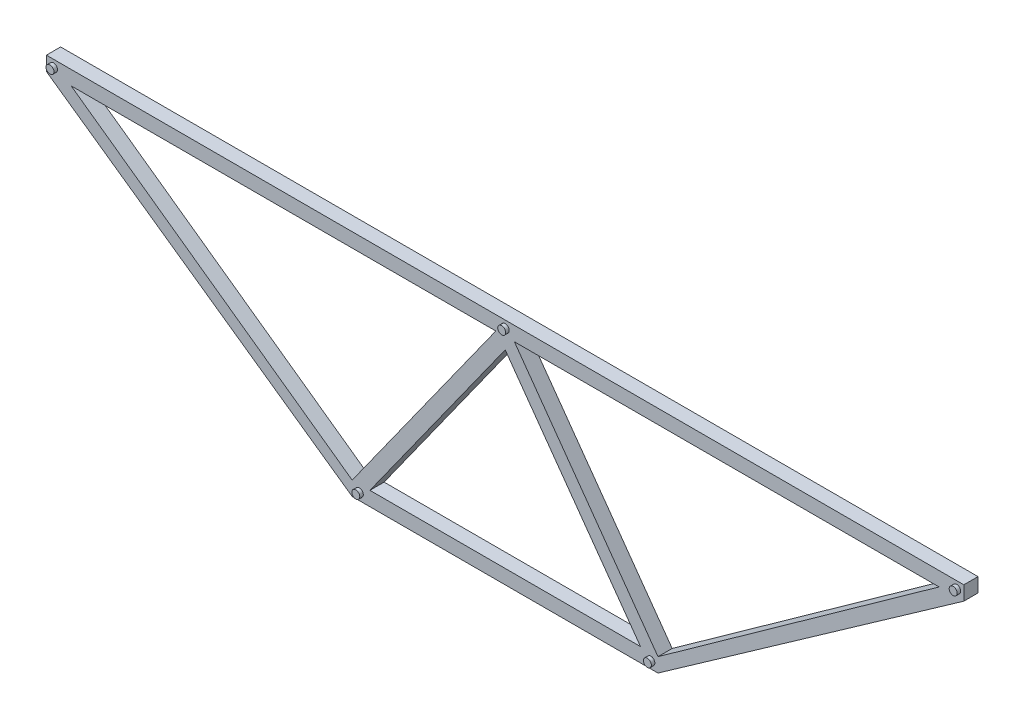
ISO-10303-21;
HEADER;
FILE_DESCRIPTION(('STEP AP214'),'2;1');
FILE_NAME('part.step','',(''),(''),'','','');
FILE_SCHEMA(('AUTOMOTIVE_DESIGN { 1 0 10303 214 1 1 1 1 }'));
ENDSEC;
DATA;
#1=APPLICATION_CONTEXT('core data for automotive mechanical design processes');
#2=APPLICATION_PROTOCOL_DEFINITION('international standard','automotive_design',2000,#1);
#3=PRODUCT_CONTEXT('',#1,'mechanical');
#4=PRODUCT('Part','Part','',(#3));
#5=PRODUCT_RELATED_PRODUCT_CATEGORY('part','',(#4));
#6=PRODUCT_DEFINITION_FORMATION('','',#4);
#7=PRODUCT_DEFINITION_CONTEXT('part definition',#1,'design');
#8=PRODUCT_DEFINITION('design','',#6,#7);
#9=PRODUCT_DEFINITION_SHAPE('','',#8);
#10=(LENGTH_UNIT() NAMED_UNIT(*) SI_UNIT(.MILLI.,.METRE.));
#11=(NAMED_UNIT(*) PLANE_ANGLE_UNIT() SI_UNIT($,.RADIAN.));
#12=(NAMED_UNIT(*) SI_UNIT($,.STERADIAN.) SOLID_ANGLE_UNIT());
#13=UNCERTAINTY_MEASURE_WITH_UNIT(LENGTH_MEASURE(1.E-05),#10,'distance_accuracy_value','');
#14=(GEOMETRIC_REPRESENTATION_CONTEXT(3) GLOBAL_UNCERTAINTY_ASSIGNED_CONTEXT((#13)) GLOBAL_UNIT_ASSIGNED_CONTEXT((#10,
#11,#12)) REPRESENTATION_CONTEXT('',''));
#15=CARTESIAN_POINT('',(0.,0.,0.));
#16=DIRECTION('',(0.,0.,1.));
#17=DIRECTION('',(1.,0.,0.));
#18=AXIS2_PLACEMENT_3D('',#15,#16,#17);
#19=CARTESIAN_POINT('',(0.,0.,18.59));
#20=DIRECTION('',(1.,0.,0.));
#21=DIRECTION('',(0.,1.,0.));
#22=AXIS2_PLACEMENT_3D('',#19,#20,#21);
#23=PLANE('',#22);
#24=DIRECTION('',(0.,-1.,0.));
#25=VECTOR('',#24,1.);
#26=CARTESIAN_POINT('',(0.,0.,0.));
#27=LINE('',#26,#25);
#28=CARTESIAN_POINT('',(0.,0.,0.));
#29=VERTEX_POINT('',#28);
#30=CARTESIAN_POINT('',(0.,-18.59,0.));
#31=VERTEX_POINT('',#30);
#32=EDGE_CURVE('E247',#29,#31,#27,.T.);
#33=ORIENTED_EDGE('',*,*,#32,.T.);
#34=DIRECTION('',(0.,0.,-1.));
#35=VECTOR('',#34,1.);
#36=CARTESIAN_POINT('',(0.,-18.59,18.59));
#37=LINE('',#36,#35);
#38=CARTESIAN_POINT('',(0.,-18.59,18.59));
#39=VERTEX_POINT('',#38);
#40=EDGE_CURVE('E49',#39,#31,#37,.T.);
#41=ORIENTED_EDGE('',*,*,#40,.F.);
#42=DIRECTION('',(0.,-1.,0.));
#43=VECTOR('',#42,1.);
#44=CARTESIAN_POINT('',(0.,0.,18.59));
#45=LINE('',#44,#43);
#46=CARTESIAN_POINT('',(0.,0.,18.59));
#47=VERTEX_POINT('',#46);
#48=EDGE_CURVE('E260',#47,#39,#45,.T.);
#49=ORIENTED_EDGE('',*,*,#48,.F.);
#50=DIRECTION('',(0.,0.,-1.));
#51=VECTOR('',#50,1.);
#52=CARTESIAN_POINT('',(0.,0.,18.59));
#53=LINE('',#52,#51);
#54=EDGE_CURVE('E280',#47,#29,#53,.T.);
#55=ORIENTED_EDGE('',*,*,#54,.T.);
#56=EDGE_LOOP('',(#33,#41,#49,#55));
#57=FACE_BOUND('',#56,.T.);
#58=ADVANCED_FACE('F50',(#57),#23,.F.);
#59=CARTESIAN_POINT('',(0.,-18.59,18.59));
#60=DIRECTION('',(0.57539565097013,0.817875201265242,0.));
#61=DIRECTION('',(-0.817875201265242,0.57539565097013,0.));
#62=AXIS2_PLACEMENT_3D('',#59,#60,#61);
#63=PLANE('',#62);
#64=DIRECTION('',(0.817875201265242,-0.57539565097013,0.));
#65=VECTOR('',#64,1.);
#66=CARTESIAN_POINT('',(0.,-18.59,0.));
#67=LINE('',#66,#65);
#68=CARTESIAN_POINT('',(400.,-300.,0.));
#69=VERTEX_POINT('',#68);
#70=EDGE_CURVE('E281',#31,#69,#67,.T.);
#71=ORIENTED_EDGE('',*,*,#70,.T.);
#72=DIRECTION('',(0.,0.,-1.));
#73=VECTOR('',#72,1.);
#74=CARTESIAN_POINT('',(400.,-300.,18.59));
#75=LINE('',#74,#73);
#76=CARTESIAN_POINT('',(400.,-300.,18.59));
#77=VERTEX_POINT('',#76);
#78=EDGE_CURVE('E310',#77,#69,#75,.T.);
#79=ORIENTED_EDGE('',*,*,#78,.F.);
#80=DIRECTION('',(0.817875201265242,-0.57539565097013,0.));
#81=VECTOR('',#80,1.);
#82=CARTESIAN_POINT('',(0.,-18.59,18.59));
#83=LINE('',#82,#81);
#84=EDGE_CURVE('E261',#39,#77,#83,.T.);
#85=ORIENTED_EDGE('',*,*,#84,.F.);
#86=ORIENTED_EDGE('',*,*,#40,.T.);
#87=EDGE_LOOP('',(#71,#79,#85,#86));
#88=FACE_BOUND('',#87,.T.);
#89=ADVANCED_FACE('F397',(#88),#63,.F.);
#90=CARTESIAN_POINT('',(400.,-300.,18.59));
#91=DIRECTION('',(0.,1.,0.));
#92=DIRECTION('',(0.,0.,1.));
#93=AXIS2_PLACEMENT_3D('',#90,#91,#92);
#94=PLANE('',#93);
#95=DIRECTION('',(1.,0.,0.));
#96=VECTOR('',#95,1.);
#97=CARTESIAN_POINT('',(400.,-300.,0.));
#98=LINE('',#97,#96);
#99=CARTESIAN_POINT('',(800.,-300.,0.));
#100=VERTEX_POINT('',#99);
#101=EDGE_CURVE('E283',#69,#100,#98,.T.);
#102=ORIENTED_EDGE('',*,*,#101,.T.);
#103=DIRECTION('',(0.,0.,-1.));
#104=VECTOR('',#103,1.);
#105=CARTESIAN_POINT('',(800.,-300.,18.59));
#106=LINE('',#105,#104);
#107=CARTESIAN_POINT('',(800.,-300.,18.59));
#108=VERTEX_POINT('',#107);
#109=EDGE_CURVE('E308',#108,#100,#106,.T.);
#110=ORIENTED_EDGE('',*,*,#109,.F.);
#111=DIRECTION('',(1.,0.,0.));
#112=VECTOR('',#111,1.);
#113=CARTESIAN_POINT('',(400.,-300.,18.59));
#114=LINE('',#113,#112);
#115=EDGE_CURVE('E264',#77,#108,#114,.T.);
#116=ORIENTED_EDGE('',*,*,#115,.F.);
#117=ORIENTED_EDGE('',*,*,#78,.T.);
#118=EDGE_LOOP('',(#102,#110,#116,#117));
#119=FACE_BOUND('',#118,.T.);
#120=ADVANCED_FACE('F403',(#119),#94,.F.);
#121=CARTESIAN_POINT('',(800.,-300.,18.59));
#122=DIRECTION('',(-0.57539565097013,0.817875201265242,0.));
#123=DIRECTION('',(-0.817875201265243,-0.57539565097013,0.));
#124=AXIS2_PLACEMENT_3D('',#121,#122,#123);
#125=PLANE('',#124);
#126=DIRECTION('',(0.817875201265242,0.57539565097013,0.));
#127=VECTOR('',#126,1.);
#128=CARTESIAN_POINT('',(800.,-300.,0.));
#129=LINE('',#128,#127);
#130=CARTESIAN_POINT('',(1200.,-18.59,0.));
#131=VERTEX_POINT('',#130);
#132=EDGE_CURVE('E286',#100,#131,#129,.T.);
#133=ORIENTED_EDGE('',*,*,#132,.T.);
#134=DIRECTION('',(0.,0.,-1.));
#135=VECTOR('',#134,1.);
#136=CARTESIAN_POINT('',(1200.,-18.59,18.59));
#137=LINE('',#136,#135);
#138=CARTESIAN_POINT('',(1200.,-18.59,18.59));
#139=VERTEX_POINT('',#138);
#140=EDGE_CURVE('E301',#139,#131,#137,.T.);
#141=ORIENTED_EDGE('',*,*,#140,.F.);
#142=DIRECTION('',(0.817875201265242,0.57539565097013,0.));
#143=VECTOR('',#142,1.);
#144=CARTESIAN_POINT('',(800.,-300.,18.59));
#145=LINE('',#144,#143);
#146=EDGE_CURVE('E268',#108,#139,#145,.T.);
#147=ORIENTED_EDGE('',*,*,#146,.F.);
#148=ORIENTED_EDGE('',*,*,#109,.T.);
#149=EDGE_LOOP('',(#133,#141,#147,#148));
#150=FACE_BOUND('',#149,.T.);
#151=ADVANCED_FACE('F424',(#150),#125,.F.);
#152=CARTESIAN_POINT('',(1200.,-18.59,18.59));
#153=DIRECTION('',(-1.,0.,0.));
#154=DIRECTION('',(0.,0.,1.));
#155=AXIS2_PLACEMENT_3D('',#152,#153,#154);
#156=PLANE('',#155);
#157=DIRECTION('',(0.,1.,0.));
#158=VECTOR('',#157,1.);
#159=CARTESIAN_POINT('',(1200.,-18.59,0.));
#160=LINE('',#159,#158);
#161=CARTESIAN_POINT('',(1200.,0.,0.));
#162=VERTEX_POINT('',#161);
#163=EDGE_CURVE('E287',#131,#162,#160,.T.);
#164=ORIENTED_EDGE('',*,*,#163,.T.);
#165=DIRECTION('',(0.,0.,-1.));
#166=VECTOR('',#165,1.);
#167=CARTESIAN_POINT('',(1200.,0.,18.59));
#168=LINE('',#167,#166);
#169=CARTESIAN_POINT('',(1200.,0.,18.59));
#170=VERTEX_POINT('',#169);
#171=EDGE_CURVE('E297',#170,#162,#168,.T.);
#172=ORIENTED_EDGE('',*,*,#171,.F.);
#173=DIRECTION('',(0.,1.,0.));
#174=VECTOR('',#173,1.);
#175=CARTESIAN_POINT('',(1200.,-18.59,18.59));
#176=LINE('',#175,#174);
#177=EDGE_CURVE('E271',#139,#170,#176,.T.);
#178=ORIENTED_EDGE('',*,*,#177,.F.);
#179=ORIENTED_EDGE('',*,*,#140,.T.);
#180=EDGE_LOOP('',(#164,#172,#178,#179));
#181=FACE_BOUND('',#180,.T.);
#182=ADVANCED_FACE('F425',(#181),#156,.F.);
#183=CARTESIAN_POINT('',(0.,0.,18.59));
#184=DIRECTION('',(0.,-1.,0.));
#185=DIRECTION('',(0.,0.,-1.));
#186=AXIS2_PLACEMENT_3D('',#183,#184,#185);
#187=PLANE('',#186);
#188=DIRECTION('',(-1.,0.,0.));
#189=VECTOR('',#188,1.);
#190=CARTESIAN_POINT('',(0.,0.,0.));
#191=LINE('',#190,#189);
#192=EDGE_CURVE('E265',#162,#29,#191,.T.);
#193=ORIENTED_EDGE('',*,*,#192,.T.);
#194=ORIENTED_EDGE('',*,*,#54,.F.);
#195=DIRECTION('',(-1.,0.,0.));
#196=VECTOR('',#195,1.);
#197=CARTESIAN_POINT('',(0.,0.,18.59));
#198=LINE('',#197,#196);
#199=EDGE_CURVE('E273',#170,#47,#198,.T.);
#200=ORIENTED_EDGE('',*,*,#199,.F.);
#201=ORIENTED_EDGE('',*,*,#171,.T.);
#202=EDGE_LOOP('',(#193,#194,#200,#201));
#203=FACE_BOUND('',#202,.T.);
#204=ADVANCED_FACE('F367',(#203),#187,.F.);
#205=CARTESIAN_POINT('',(0.,0.,18.59));
#206=DIRECTION('',(0.,0.,1.));
#207=DIRECTION('',(1.,0.,0.));
#208=AXIS2_PLACEMENT_3D('',#205,#206,#207);
#209=PLANE('',#208);
#210=CARTESIAN_POINT('',(409.295,-290.705,18.59));
#211=DIRECTION('',(0.,0.,1.));
#212=DIRECTION('',(1.,0.,0.));
#213=AXIS2_PLACEMENT_3D('',#210,#211,#212);
#214=CIRCLE('',#213,5.20699999999986);
#215=CARTESIAN_POINT('',(414.502,-290.705,18.59));
#216=VERTEX_POINT('',#215);
#217=EDGE_CURVE('E11',#216,#216,#214,.T.);
#218=ORIENTED_EDGE('',*,*,#217,.F.);
#219=EDGE_LOOP('',(#218));
#220=FACE_BOUND('',#219,.T.);
#221=CARTESIAN_POINT('',(790.705,-290.705,18.59));
#222=DIRECTION('',(0.,0.,1.));
#223=DIRECTION('',(1.,0.,0.));
#224=AXIS2_PLACEMENT_3D('',#221,#222,#223);
#225=CIRCLE('',#224,5.20699999999998);
#226=CARTESIAN_POINT('',(795.912,-290.705,18.59));
#227=VERTEX_POINT('',#226);
#228=EDGE_CURVE('E57',#227,#227,#225,.T.);
#229=ORIENTED_EDGE('',*,*,#228,.F.);
#230=EDGE_LOOP('',(#229));
#231=FACE_BOUND('',#230,.T.);
#232=CARTESIAN_POINT('',(600.156298082309,-9.295,18.59));
#233=DIRECTION('',(0.,0.,1.));
#234=DIRECTION('',(1.,0.,0.));
#235=AXIS2_PLACEMENT_3D('',#232,#233,#234);
#236=CIRCLE('',#235,5.20699999999998);
#237=CARTESIAN_POINT('',(605.363298082309,-9.295,18.59));
#238=VERTEX_POINT('',#237);
#239=EDGE_CURVE('E328',#238,#238,#236,.T.);
#240=ORIENTED_EDGE('',*,*,#239,.F.);
#241=EDGE_LOOP('',(#240));
#242=FACE_BOUND('',#241,.T.);
#243=CARTESIAN_POINT('',(9.295,-9.295,18.59));
#244=DIRECTION('',(0.,0.,1.));
#245=DIRECTION('',(1.,0.,0.));
#246=AXIS2_PLACEMENT_3D('',#243,#244,#245);
#247=CIRCLE('',#246,5.20699999999998);
#248=CARTESIAN_POINT('',(14.502,-9.295,18.59));
#249=VERTEX_POINT('',#248);
#250=EDGE_CURVE('E323',#249,#249,#247,.T.);
#251=ORIENTED_EDGE('',*,*,#250,.F.);
#252=EDGE_LOOP('',(#251));
#253=FACE_BOUND('',#252,.T.);
#254=CARTESIAN_POINT('',(1190.705,-9.295,18.59));
#255=DIRECTION('',(0.,0.,1.));
#256=DIRECTION('',(1.,0.,0.));
#257=AXIS2_PLACEMENT_3D('',#254,#255,#256);
#258=CIRCLE('',#257,5.20699999999987);
#259=CARTESIAN_POINT('',(1195.912,-9.295,18.59));
#260=VERTEX_POINT('',#259);
#261=EDGE_CURVE('E318',#260,#260,#258,.T.);
#262=ORIENTED_EDGE('',*,*,#261,.F.);
#263=EDGE_LOOP('',(#262));
#264=FACE_BOUND('',#263,.T.);
#265=DIRECTION('',(1.,0.,0.));
#266=VECTOR('',#265,1.);
#267=CARTESIAN_POINT('',(777.149302825359,-281.41,18.59));
#268=LINE('',#267,#266);
#269=CARTESIAN_POINT('',(423.163293339259,-281.41,18.59));
#270=VERTEX_POINT('',#269);
#271=CARTESIAN_POINT('',(777.149302825359,-281.41,18.59));
#272=VERTEX_POINT('',#271);
#273=EDGE_CURVE('E63',#270,#272,#268,.T.);
#274=ORIENTED_EDGE('',*,*,#273,.F.);
#275=DIRECTION('',(-0.581506275255963,-0.813541917689516,0.));
#276=VECTOR('',#275,1.);
#277=CARTESIAN_POINT('',(600.156298082309,-33.7923308133531,18.59));
#278=LINE('',#277,#276);
#279=CARTESIAN_POINT('',(600.156298082309,-33.7923308133531,18.59));
#280=VERTEX_POINT('',#279);
#281=EDGE_CURVE('E205',#280,#270,#278,.T.);
#282=ORIENTED_EDGE('',*,*,#281,.F.);
#283=DIRECTION('',(-0.581506275255964,0.813541917689516,0.));
#284=VECTOR('',#283,1.);
#285=CARTESIAN_POINT('',(777.149302825359,-281.41,18.59));
#286=LINE('',#285,#284);
#287=EDGE_CURVE('E206',#272,#280,#286,.T.);
#288=ORIENTED_EDGE('',*,*,#287,.F.);
#289=EDGE_LOOP('',(#274,#282,#288));
#290=FACE_BOUND('',#289,.T.);
#291=DIRECTION('',(-1.,0.,0.));
#292=VECTOR('',#291,1.);
#293=CARTESIAN_POINT('',(612.140621227215,-18.59,18.59));
#294=LINE('',#293,#292);
#295=CARTESIAN_POINT('',(1167.69179612558,-18.5899999999999,18.59));
#296=VERTEX_POINT('',#295);
#297=CARTESIAN_POINT('',(612.140621227216,-18.59,18.59));
#298=VERTEX_POINT('',#297);
#299=EDGE_CURVE('E75',#296,#298,#294,.T.);
#300=ORIENTED_EDGE('',*,*,#299,.F.);
#301=DIRECTION('',(0.813541917689517,0.581506275255963,0.));
#302=VECTOR('',#301,1.);
#303=CARTESIAN_POINT('',(800.,-281.41,18.59));
#304=LINE('',#303,#302);
#305=CARTESIAN_POINT('',(800.,-281.41,18.59));
#306=VERTEX_POINT('',#305);
#307=EDGE_CURVE('E167',#306,#296,#304,.T.);
#308=ORIENTED_EDGE('',*,*,#307,.F.);
#309=DIRECTION('',(0.581506275255963,-0.813541917689516,0.));
#310=VECTOR('',#309,1.);
#311=CARTESIAN_POINT('',(800.,-281.41,18.59));
#312=LINE('',#311,#310);
#313=EDGE_CURVE('E172',#298,#306,#312,.T.);
#314=ORIENTED_EDGE('',*,*,#313,.F.);
#315=EDGE_LOOP('',(#300,#308,#314));
#316=FACE_BOUND('',#315,.T.);
#317=DIRECTION('',(-1.,0.,0.));
#318=VECTOR('',#317,1.);
#319=CARTESIAN_POINT('',(587.859378772784,-18.5899999999999,18.59));
#320=LINE('',#319,#318);
#321=CARTESIAN_POINT('',(587.859378772784,-18.5899999999999,18.59));
#322=VERTEX_POINT('',#321);
#323=CARTESIAN_POINT('',(32.3082038744242,-18.59,18.59));
#324=VERTEX_POINT('',#323);
#325=EDGE_CURVE('E213',#322,#324,#320,.T.);
#326=ORIENTED_EDGE('',*,*,#325,.F.);
#327=DIRECTION('',(0.581506275255963,0.813541917689516,0.));
#328=VECTOR('',#327,1.);
#329=CARTESIAN_POINT('',(400.,-281.41,18.59));
#330=LINE('',#329,#328);
#331=CARTESIAN_POINT('',(400.,-281.41,18.59));
#332=VERTEX_POINT('',#331);
#333=EDGE_CURVE('E228',#332,#322,#330,.T.);
#334=ORIENTED_EDGE('',*,*,#333,.F.);
#335=DIRECTION('',(0.813541917689516,-0.581506275255964,0.));
#336=VECTOR('',#335,1.);
#337=CARTESIAN_POINT('',(32.3082038744242,-18.59,18.59));
#338=LINE('',#337,#336);
#339=EDGE_CURVE('E238',#324,#332,#338,.T.);
#340=ORIENTED_EDGE('',*,*,#339,.F.);
#341=EDGE_LOOP('',(#326,#334,#340));
#342=FACE_BOUND('',#341,.T.);
#343=ORIENTED_EDGE('',*,*,#48,.T.);
#344=ORIENTED_EDGE('',*,*,#84,.T.);
#345=ORIENTED_EDGE('',*,*,#115,.T.);
#346=ORIENTED_EDGE('',*,*,#146,.T.);
#347=ORIENTED_EDGE('',*,*,#177,.T.);
#348=ORIENTED_EDGE('',*,*,#199,.T.);
#349=EDGE_LOOP('',(#343,#344,#345,#346,#347,#348));
#350=FACE_BOUND('',#349,.T.);
#351=ADVANCED_FACE('F174',(#220,#231,#242,#253,#264,#290,#316,#342,#350),#209,.T.);
#352=CARTESIAN_POINT('',(0.,0.,0.));
#353=DIRECTION('',(0.,0.,1.));
#354=DIRECTION('',(1.,0.,0.));
#355=AXIS2_PLACEMENT_3D('',#352,#353,#354);
#356=PLANE('',#355);
#357=DIRECTION('',(-0.581506275255963,-0.813541917689516,0.));
#358=VECTOR('',#357,1.);
#359=CARTESIAN_POINT('',(600.156298082309,-33.7923308133531,0.));
#360=LINE('',#359,#358);
#361=CARTESIAN_POINT('',(600.156298082309,-33.7923308133531,0.));
#362=VERTEX_POINT('',#361);
#363=CARTESIAN_POINT('',(423.163293339259,-281.41,0.));
#364=VERTEX_POINT('',#363);
#365=EDGE_CURVE('E200',#362,#364,#360,.T.);
#366=ORIENTED_EDGE('',*,*,#365,.T.);
#367=DIRECTION('',(1.,0.,0.));
#368=VECTOR('',#367,1.);
#369=CARTESIAN_POINT('',(777.149302825359,-281.41,0.));
#370=LINE('',#369,#368);
#371=CARTESIAN_POINT('',(777.149302825359,-281.41,0.));
#372=VERTEX_POINT('',#371);
#373=EDGE_CURVE('E210',#364,#372,#370,.T.);
#374=ORIENTED_EDGE('',*,*,#373,.T.);
#375=DIRECTION('',(-0.581506275255964,0.813541917689516,0.));
#376=VECTOR('',#375,1.);
#377=CARTESIAN_POINT('',(777.149302825359,-281.41,0.));
#378=LINE('',#377,#376);
#379=EDGE_CURVE('E220',#372,#362,#378,.T.);
#380=ORIENTED_EDGE('',*,*,#379,.T.);
#381=EDGE_LOOP('',(#366,#374,#380));
#382=FACE_BOUND('',#381,.T.);
#383=DIRECTION('',(0.813541917689517,0.581506275255963,0.));
#384=VECTOR('',#383,1.);
#385=CARTESIAN_POINT('',(800.,-281.41,0.));
#386=LINE('',#385,#384);
#387=CARTESIAN_POINT('',(800.,-281.41,0.));
#388=VERTEX_POINT('',#387);
#389=CARTESIAN_POINT('',(1167.69179612558,-18.5899999999999,0.));
#390=VERTEX_POINT('',#389);
#391=EDGE_CURVE('E186',#388,#390,#386,.T.);
#392=ORIENTED_EDGE('',*,*,#391,.T.);
#393=DIRECTION('',(-1.,0.,0.));
#394=VECTOR('',#393,1.);
#395=CARTESIAN_POINT('',(612.140621227215,-18.59,0.));
#396=LINE('',#395,#394);
#397=CARTESIAN_POINT('',(612.140621227215,-18.59,0.));
#398=VERTEX_POINT('',#397);
#399=EDGE_CURVE('E158',#390,#398,#396,.T.);
#400=ORIENTED_EDGE('',*,*,#399,.T.);
#401=DIRECTION('',(0.581506275255963,-0.813541917689516,0.));
#402=VECTOR('',#401,1.);
#403=CARTESIAN_POINT('',(800.,-281.41,0.));
#404=LINE('',#403,#402);
#405=EDGE_CURVE('E188',#398,#388,#404,.T.);
#406=ORIENTED_EDGE('',*,*,#405,.T.);
#407=EDGE_LOOP('',(#392,#400,#406));
#408=FACE_BOUND('',#407,.T.);
#409=DIRECTION('',(0.581506275255963,0.813541917689516,0.));
#410=VECTOR('',#409,1.);
#411=CARTESIAN_POINT('',(400.,-281.41,0.));
#412=LINE('',#411,#410);
#413=CARTESIAN_POINT('',(400.,-281.41,0.));
#414=VERTEX_POINT('',#413);
#415=CARTESIAN_POINT('',(587.859378772784,-18.5899999999999,0.));
#416=VERTEX_POINT('',#415);
#417=EDGE_CURVE('E235',#414,#416,#412,.T.);
#418=ORIENTED_EDGE('',*,*,#417,.T.);
#419=DIRECTION('',(-1.,0.,0.));
#420=VECTOR('',#419,1.);
#421=CARTESIAN_POINT('',(587.859378772784,-18.5899999999999,0.));
#422=LINE('',#421,#420);
#423=CARTESIAN_POINT('',(32.3082038744242,-18.59,0.));
#424=VERTEX_POINT('',#423);
#425=EDGE_CURVE('E221',#416,#424,#422,.T.);
#426=ORIENTED_EDGE('',*,*,#425,.T.);
#427=DIRECTION('',(0.813541917689516,-0.581506275255964,0.));
#428=VECTOR('',#427,1.);
#429=CARTESIAN_POINT('',(32.3082038744242,-18.59,0.));
#430=LINE('',#429,#428);
#431=EDGE_CURVE('E227',#424,#414,#430,.T.);
#432=ORIENTED_EDGE('',*,*,#431,.T.);
#433=EDGE_LOOP('',(#418,#426,#432));
#434=FACE_BOUND('',#433,.T.);
#435=ORIENTED_EDGE('',*,*,#32,.F.);
#436=ORIENTED_EDGE('',*,*,#192,.F.);
#437=ORIENTED_EDGE('',*,*,#163,.F.);
#438=ORIENTED_EDGE('',*,*,#132,.F.);
#439=ORIENTED_EDGE('',*,*,#101,.F.);
#440=ORIENTED_EDGE('',*,*,#70,.F.);
#441=EDGE_LOOP('',(#435,#436,#437,#438,#439,#440));
#442=FACE_BOUND('',#441,.T.);
#443=ADVANCED_FACE('F369',(#382,#408,#434,#442),#356,.F.);
#444=CARTESIAN_POINT('',(587.859378772784,-18.5899999999999,0.));
#445=DIRECTION('',(0.,1.,0.));
#446=DIRECTION('',(-1.,0.,0.));
#447=AXIS2_PLACEMENT_3D('',#444,#445,#446);
#448=PLANE('',#447);
#449=ORIENTED_EDGE('',*,*,#325,.T.);
#450=DIRECTION('',(0.,0.,1.));
#451=VECTOR('',#450,1.);
#452=CARTESIAN_POINT('',(32.3082038744242,-18.59,0.));
#453=LINE('',#452,#451);
#454=EDGE_CURVE('E240',#424,#324,#453,.T.);
#455=ORIENTED_EDGE('',*,*,#454,.F.);
#456=ORIENTED_EDGE('',*,*,#425,.F.);
#457=DIRECTION('',(0.,0.,1.));
#458=VECTOR('',#457,1.);
#459=CARTESIAN_POINT('',(587.859378772784,-18.5899999999999,0.));
#460=LINE('',#459,#458);
#461=EDGE_CURVE('E246',#416,#322,#460,.T.);
#462=ORIENTED_EDGE('',*,*,#461,.T.);
#463=EDGE_LOOP('',(#449,#455,#456,#462));
#464=FACE_BOUND('',#463,.T.);
#465=ADVANCED_FACE('F440',(#464),#448,.F.);
#466=CARTESIAN_POINT('',(400.,-281.41,0.));
#467=DIRECTION('',(0.813541917689516,-0.581506275255963,0.));
#468=DIRECTION('',(0.581506275255964,0.813541917689516,0.));
#469=AXIS2_PLACEMENT_3D('',#466,#467,#468);
#470=PLANE('',#469);
#471=ORIENTED_EDGE('',*,*,#333,.T.);
#472=ORIENTED_EDGE('',*,*,#461,.F.);
#473=ORIENTED_EDGE('',*,*,#417,.F.);
#474=DIRECTION('',(0.,0.,1.));
#475=VECTOR('',#474,1.);
#476=CARTESIAN_POINT('',(400.,-281.41,0.));
#477=LINE('',#476,#475);
#478=EDGE_CURVE('E253',#414,#332,#477,.T.);
#479=ORIENTED_EDGE('',*,*,#478,.T.);
#480=EDGE_LOOP('',(#471,#472,#473,#479));
#481=FACE_BOUND('',#480,.T.);
#482=ADVANCED_FACE('F442',(#481),#470,.F.);
#483=CARTESIAN_POINT('',(32.3082038744242,-18.59,0.));
#484=DIRECTION('',(-0.581506275255964,-0.813541917689516,0.));
#485=DIRECTION('',(0.813541917689516,-0.581506275255964,0.));
#486=AXIS2_PLACEMENT_3D('',#483,#484,#485);
#487=PLANE('',#486);
#488=ORIENTED_EDGE('',*,*,#339,.T.);
#489=ORIENTED_EDGE('',*,*,#478,.F.);
#490=ORIENTED_EDGE('',*,*,#431,.F.);
#491=ORIENTED_EDGE('',*,*,#454,.T.);
#492=EDGE_LOOP('',(#488,#489,#490,#491));
#493=FACE_BOUND('',#492,.T.);
#494=ADVANCED_FACE('F444',(#493),#487,.F.);
#495=CARTESIAN_POINT('',(612.140621227215,-18.59,0.));
#496=DIRECTION('',(0.,1.,0.));
#497=DIRECTION('',(-1.,0.,0.));
#498=AXIS2_PLACEMENT_3D('',#495,#496,#497);
#499=PLANE('',#498);
#500=ORIENTED_EDGE('',*,*,#299,.T.);
#501=DIRECTION('',(0.,0.,1.));
#502=VECTOR('',#501,1.);
#503=CARTESIAN_POINT('',(612.140621227215,-18.59,0.));
#504=LINE('',#503,#502);
#505=EDGE_CURVE('E189',#398,#298,#504,.T.);
#506=ORIENTED_EDGE('',*,*,#505,.F.);
#507=ORIENTED_EDGE('',*,*,#399,.F.);
#508=DIRECTION('',(0.,0.,1.));
#509=VECTOR('',#508,1.);
#510=CARTESIAN_POINT('',(1167.69179612558,-18.5899999999999,0.));
#511=LINE('',#510,#509);
#512=EDGE_CURVE('E152',#390,#296,#511,.T.);
#513=ORIENTED_EDGE('',*,*,#512,.T.);
#514=EDGE_LOOP('',(#500,#506,#507,#513));
#515=FACE_BOUND('',#514,.T.);
#516=ADVANCED_FACE('F156',(#515),#499,.F.);
#517=CARTESIAN_POINT('',(800.,-281.41,0.));
#518=DIRECTION('',(0.581506275255963,-0.813541917689517,0.));
#519=DIRECTION('',(0.813541917689517,0.581506275255963,0.));
#520=AXIS2_PLACEMENT_3D('',#517,#518,#519);
#521=PLANE('',#520);
#522=ORIENTED_EDGE('',*,*,#307,.T.);
#523=ORIENTED_EDGE('',*,*,#512,.F.);
#524=ORIENTED_EDGE('',*,*,#391,.F.);
#525=DIRECTION('',(0.,0.,1.));
#526=VECTOR('',#525,1.);
#527=CARTESIAN_POINT('',(800.,-281.41,0.));
#528=LINE('',#527,#526);
#529=EDGE_CURVE('E165',#388,#306,#528,.T.);
#530=ORIENTED_EDGE('',*,*,#529,.T.);
#531=EDGE_LOOP('',(#522,#523,#524,#530));
#532=FACE_BOUND('',#531,.T.);
#533=ADVANCED_FACE('F170',(#532),#521,.F.);
#534=CARTESIAN_POINT('',(800.,-281.41,0.));
#535=DIRECTION('',(-0.813541917689516,-0.581506275255963,0.));
#536=DIRECTION('',(0.581506275255963,-0.813541917689516,0.));
#537=AXIS2_PLACEMENT_3D('',#534,#535,#536);
#538=PLANE('',#537);
#539=ORIENTED_EDGE('',*,*,#313,.T.);
#540=ORIENTED_EDGE('',*,*,#529,.F.);
#541=ORIENTED_EDGE('',*,*,#405,.F.);
#542=ORIENTED_EDGE('',*,*,#505,.T.);
#543=EDGE_LOOP('',(#539,#540,#541,#542));
#544=FACE_BOUND('',#543,.T.);
#545=ADVANCED_FACE('F399',(#544),#538,.F.);
#546=CARTESIAN_POINT('',(777.149302825359,-281.41,0.));
#547=DIRECTION('',(0.,-1.,0.));
#548=DIRECTION('',(1.,0.,0.));
#549=AXIS2_PLACEMENT_3D('',#546,#547,#548);
#550=PLANE('',#549);
#551=ORIENTED_EDGE('',*,*,#273,.T.);
#552=DIRECTION('',(0.,0.,1.));
#553=VECTOR('',#552,1.);
#554=CARTESIAN_POINT('',(777.149302825359,-281.41,0.));
#555=LINE('',#554,#553);
#556=EDGE_CURVE('E198',#372,#272,#555,.T.);
#557=ORIENTED_EDGE('',*,*,#556,.F.);
#558=ORIENTED_EDGE('',*,*,#373,.F.);
#559=DIRECTION('',(0.,0.,1.));
#560=VECTOR('',#559,1.);
#561=CARTESIAN_POINT('',(423.163293339259,-281.41,0.));
#562=LINE('',#561,#560);
#563=EDGE_CURVE('E180',#364,#270,#562,.T.);
#564=ORIENTED_EDGE('',*,*,#563,.T.);
#565=EDGE_LOOP('',(#551,#557,#558,#564));
#566=FACE_BOUND('',#565,.T.);
#567=ADVANCED_FACE('F382',(#566),#550,.F.);
#568=CARTESIAN_POINT('',(600.156298082309,-33.7923308133531,0.));
#569=DIRECTION('',(-0.813541917689516,0.581506275255963,0.));
#570=DIRECTION('',(-0.581506275255963,-0.813541917689517,0.));
#571=AXIS2_PLACEMENT_3D('',#568,#569,#570);
#572=PLANE('',#571);
#573=ORIENTED_EDGE('',*,*,#281,.T.);
#574=ORIENTED_EDGE('',*,*,#563,.F.);
#575=ORIENTED_EDGE('',*,*,#365,.F.);
#576=DIRECTION('',(0.,0.,1.));
#577=VECTOR('',#576,1.);
#578=CARTESIAN_POINT('',(600.156298082309,-33.7923308133531,0.));
#579=LINE('',#578,#577);
#580=EDGE_CURVE('E185',#362,#280,#579,.T.);
#581=ORIENTED_EDGE('',*,*,#580,.T.);
#582=EDGE_LOOP('',(#573,#574,#575,#581));
#583=FACE_BOUND('',#582,.T.);
#584=ADVANCED_FACE('F390',(#583),#572,.F.);
#585=CARTESIAN_POINT('',(777.149302825359,-281.41,0.));
#586=DIRECTION('',(0.813541917689516,0.581506275255964,0.));
#587=DIRECTION('',(-0.581506275255964,0.813541917689516,0.));
#588=AXIS2_PLACEMENT_3D('',#585,#586,#587);
#589=PLANE('',#588);
#590=ORIENTED_EDGE('',*,*,#287,.T.);
#591=ORIENTED_EDGE('',*,*,#580,.F.);
#592=ORIENTED_EDGE('',*,*,#379,.F.);
#593=ORIENTED_EDGE('',*,*,#556,.T.);
#594=EDGE_LOOP('',(#590,#591,#592,#593));
#595=FACE_BOUND('',#594,.T.);
#596=ADVANCED_FACE('F379',(#595),#589,.F.);
#597=CARTESIAN_POINT('',(1190.705,-9.295,23.2));
#598=DIRECTION('',(0.,0.,-1.));
#599=DIRECTION('',(-1.,0.,0.));
#600=AXIS2_PLACEMENT_3D('',#597,#598,#599);
#601=CYLINDRICAL_SURFACE('',#600,5.20699999999987);
#602=ORIENTED_EDGE('',*,*,#261,.T.);
#603=EDGE_LOOP('',(#602));
#604=FACE_BOUND('',#603,.T.);
#605=CARTESIAN_POINT('',(1190.705,-9.295,23.2));
#606=DIRECTION('',(0.,0.,-1.));
#607=DIRECTION('',(-1.,0.,0.));
#608=AXIS2_PLACEMENT_3D('',#605,#606,#607);
#609=CIRCLE('',#608,5.20699999999987);
#610=CARTESIAN_POINT('',(1185.498,-9.295,23.2));
#611=VERTEX_POINT('',#610);
#612=EDGE_CURVE('E162',#611,#611,#609,.T.);
#613=ORIENTED_EDGE('',*,*,#612,.T.);
#614=EDGE_LOOP('',(#613));
#615=FACE_BOUND('',#614,.T.);
#616=ADVANCED_FACE('F393',(#604,#615),#601,.T.);
#617=CARTESIAN_POINT('',(1190.705,-9.295,23.2));
#618=DIRECTION('',(0.,0.,-1.));
#619=DIRECTION('',(-1.,0.,0.));
#620=AXIS2_PLACEMENT_3D('',#617,#618,#619);
#621=PLANE('',#620);
#622=ORIENTED_EDGE('',*,*,#612,.F.);
#623=EDGE_LOOP('',(#622));
#624=FACE_BOUND('',#623,.T.);
#625=ADVANCED_FACE('F512',(#624),#621,.F.);
#626=CARTESIAN_POINT('',(9.295,-9.295,23.2));
#627=DIRECTION('',(0.,0.,-1.));
#628=DIRECTION('',(-1.,0.,0.));
#629=AXIS2_PLACEMENT_3D('',#626,#627,#628);
#630=CYLINDRICAL_SURFACE('',#629,5.20699999999998);
#631=ORIENTED_EDGE('',*,*,#250,.T.);
#632=EDGE_LOOP('',(#631));
#633=FACE_BOUND('',#632,.T.);
#634=CARTESIAN_POINT('',(9.295,-9.295,23.2));
#635=DIRECTION('',(0.,0.,-1.));
#636=DIRECTION('',(-1.,0.,0.));
#637=AXIS2_PLACEMENT_3D('',#634,#635,#636);
#638=CIRCLE('',#637,5.20699999999998);
#639=CARTESIAN_POINT('',(4.08800000000002,-9.295,23.2));
#640=VERTEX_POINT('',#639);
#641=EDGE_CURVE('E338',#640,#640,#638,.T.);
#642=ORIENTED_EDGE('',*,*,#641,.T.);
#643=EDGE_LOOP('',(#642));
#644=FACE_BOUND('',#643,.T.);
#645=ADVANCED_FACE('F519',(#633,#644),#630,.T.);
#646=CARTESIAN_POINT('',(9.295,-9.295,23.2));
#647=DIRECTION('',(0.,0.,-1.));
#648=DIRECTION('',(-1.,0.,0.));
#649=AXIS2_PLACEMENT_3D('',#646,#647,#648);
#650=PLANE('',#649);
#651=ORIENTED_EDGE('',*,*,#641,.F.);
#652=EDGE_LOOP('',(#651));
#653=FACE_BOUND('',#652,.T.);
#654=ADVANCED_FACE('F529',(#653),#650,.F.);
#655=CARTESIAN_POINT('',(600.156298082309,-9.295,23.2));
#656=DIRECTION('',(0.,0.,-1.));
#657=DIRECTION('',(-1.,0.,0.));
#658=AXIS2_PLACEMENT_3D('',#655,#656,#657);
#659=CYLINDRICAL_SURFACE('',#658,5.20699999999998);
#660=ORIENTED_EDGE('',*,*,#239,.T.);
#661=EDGE_LOOP('',(#660));
#662=FACE_BOUND('',#661,.T.);
#663=CARTESIAN_POINT('',(600.156298082309,-9.295,23.2));
#664=DIRECTION('',(0.,0.,-1.));
#665=DIRECTION('',(-1.,0.,0.));
#666=AXIS2_PLACEMENT_3D('',#663,#664,#665);
#667=CIRCLE('',#666,5.20699999999998);
#668=CARTESIAN_POINT('',(594.949298082309,-9.295,23.2));
#669=VERTEX_POINT('',#668);
#670=EDGE_CURVE('E341',#669,#669,#667,.T.);
#671=ORIENTED_EDGE('',*,*,#670,.T.);
#672=EDGE_LOOP('',(#671));
#673=FACE_BOUND('',#672,.T.);
#674=ADVANCED_FACE('F365',(#662,#673),#659,.T.);
#675=CARTESIAN_POINT('',(600.156298082309,-9.295,23.2));
#676=DIRECTION('',(0.,0.,-1.));
#677=DIRECTION('',(-1.,0.,0.));
#678=AXIS2_PLACEMENT_3D('',#675,#676,#677);
#679=PLANE('',#678);
#680=ORIENTED_EDGE('',*,*,#670,.F.);
#681=EDGE_LOOP('',(#680));
#682=FACE_BOUND('',#681,.T.);
#683=ADVANCED_FACE('F548',(#682),#679,.F.);
#684=CARTESIAN_POINT('',(790.705,-290.705,23.2));
#685=DIRECTION('',(0.,0.,-1.));
#686=DIRECTION('',(-1.,0.,0.));
#687=AXIS2_PLACEMENT_3D('',#684,#685,#686);
#688=CYLINDRICAL_SURFACE('',#687,5.20699999999998);
#689=ORIENTED_EDGE('',*,*,#228,.T.);
#690=EDGE_LOOP('',(#689));
#691=FACE_BOUND('',#690,.T.);
#692=CARTESIAN_POINT('',(790.705,-290.705,23.2));
#693=DIRECTION('',(0.,0.,-1.));
#694=DIRECTION('',(-1.,0.,0.));
#695=AXIS2_PLACEMENT_3D('',#692,#693,#694);
#696=CIRCLE('',#695,5.20699999999998);
#697=CARTESIAN_POINT('',(785.498,-290.705,23.2));
#698=VERTEX_POINT('',#697);
#699=EDGE_CURVE('E347',#698,#698,#696,.T.);
#700=ORIENTED_EDGE('',*,*,#699,.T.);
#701=EDGE_LOOP('',(#700));
#702=FACE_BOUND('',#701,.T.);
#703=ADVANCED_FACE('F557',(#691,#702),#688,.T.);
#704=CARTESIAN_POINT('',(790.705,-290.705,23.2));
#705=DIRECTION('',(0.,0.,-1.));
#706=DIRECTION('',(-1.,0.,0.));
#707=AXIS2_PLACEMENT_3D('',#704,#705,#706);
#708=PLANE('',#707);
#709=ORIENTED_EDGE('',*,*,#699,.F.);
#710=EDGE_LOOP('',(#709));
#711=FACE_BOUND('',#710,.T.);
#712=ADVANCED_FACE('F566',(#711),#708,.F.);
#713=CARTESIAN_POINT('',(409.295,-290.705,23.2));
#714=DIRECTION('',(0.,0.,-1.));
#715=DIRECTION('',(-1.,0.,0.));
#716=AXIS2_PLACEMENT_3D('',#713,#714,#715);
#717=CYLINDRICAL_SURFACE('',#716,5.20699999999986);
#718=ORIENTED_EDGE('',*,*,#217,.T.);
#719=EDGE_LOOP('',(#718));
#720=FACE_BOUND('',#719,.T.);
#721=CARTESIAN_POINT('',(409.295,-290.705,23.2));
#722=DIRECTION('',(0.,0.,-1.));
#723=DIRECTION('',(-1.,0.,0.));
#724=AXIS2_PLACEMENT_3D('',#721,#722,#723);
#725=CIRCLE('',#724,5.20699999999986);
#726=CARTESIAN_POINT('',(404.088,-290.705,23.2));
#727=VERTEX_POINT('',#726);
#728=EDGE_CURVE('E348',#727,#727,#725,.T.);
#729=ORIENTED_EDGE('',*,*,#728,.T.);
#730=EDGE_LOOP('',(#729));
#731=FACE_BOUND('',#730,.T.);
#732=ADVANCED_FACE('F580',(#720,#731),#717,.T.);
#733=CARTESIAN_POINT('',(409.295,-290.705,23.2));
#734=DIRECTION('',(0.,0.,-1.));
#735=DIRECTION('',(-1.,0.,0.));
#736=AXIS2_PLACEMENT_3D('',#733,#734,#735);
#737=PLANE('',#736);
#738=ORIENTED_EDGE('',*,*,#728,.F.);
#739=EDGE_LOOP('',(#738));
#740=FACE_BOUND('',#739,.T.);
#741=ADVANCED_FACE('F586',(#740),#737,.F.);
#742=CLOSED_SHELL('',(#58,#89,#120,#151,#182,#204,#351,#443,#465,#482,#494,#516,#533,#545,#567,
#584,#596,#616,#625,#645,#654,#674,#683,#703,#712,#732,#741));
#743=MANIFOLD_SOLID_BREP('B2',#742);
#744=ADVANCED_BREP_SHAPE_REPRESENTATION('',(#18,#743),#14);
#745=SHAPE_DEFINITION_REPRESENTATION(#9,#744);
ENDSEC;
END-ISO-10303-21;
